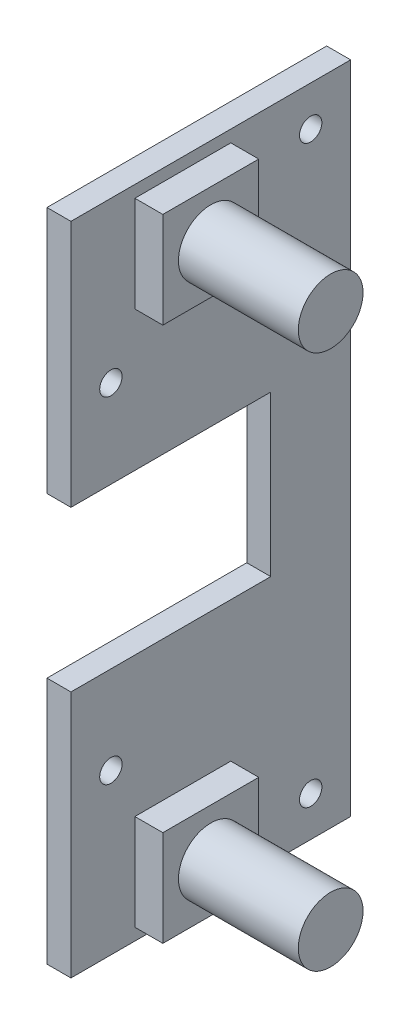
ISO-10303-21;
HEADER;
FILE_DESCRIPTION(('STEP AP214'),'2;1');
FILE_NAME('part.step','',(''),(''),'','','');
FILE_SCHEMA(('AUTOMOTIVE_DESIGN { 1 0 10303 214 1 1 1 1 }'));
ENDSEC;
DATA;
#1=APPLICATION_CONTEXT('core data for automotive mechanical design processes');
#2=APPLICATION_PROTOCOL_DEFINITION('international standard','automotive_design',2000,#1);
#3=PRODUCT_CONTEXT('',#1,'mechanical');
#4=PRODUCT('Part','Part','',(#3));
#5=PRODUCT_RELATED_PRODUCT_CATEGORY('part','',(#4));
#6=PRODUCT_DEFINITION_FORMATION('','',#4);
#7=PRODUCT_DEFINITION_CONTEXT('part definition',#1,'design');
#8=PRODUCT_DEFINITION('design','',#6,#7);
#9=PRODUCT_DEFINITION_SHAPE('','',#8);
#10=(LENGTH_UNIT() NAMED_UNIT(*) SI_UNIT(.MILLI.,.METRE.));
#11=(NAMED_UNIT(*) PLANE_ANGLE_UNIT() SI_UNIT($,.RADIAN.));
#12=(NAMED_UNIT(*) SI_UNIT($,.STERADIAN.) SOLID_ANGLE_UNIT());
#13=UNCERTAINTY_MEASURE_WITH_UNIT(LENGTH_MEASURE(1.E-05),#10,'distance_accuracy_value','');
#14=(GEOMETRIC_REPRESENTATION_CONTEXT(3) GLOBAL_UNCERTAINTY_ASSIGNED_CONTEXT((#13)) GLOBAL_UNIT_ASSIGNED_CONTEXT((#10,
#11,#12)) REPRESENTATION_CONTEXT('',''));
#15=CARTESIAN_POINT('',(0.,0.,0.));
#16=DIRECTION('',(0.,0.,1.));
#17=DIRECTION('',(1.,0.,0.));
#18=AXIS2_PLACEMENT_3D('',#15,#16,#17);
#19=CARTESIAN_POINT('',(3.,0.,0.));
#20=DIRECTION('',(1.,0.,0.));
#21=DIRECTION('',(0.,0.,-1.));
#22=AXIS2_PLACEMENT_3D('',#19,#20,#21);
#23=PLANE('',#22);
#24=CARTESIAN_POINT('',(3.,21.,30.));
#25=DIRECTION('',(-1.,0.,0.));
#26=DIRECTION('',(0.,0.,-1.));
#27=AXIS2_PLACEMENT_3D('',#24,#25,#26);
#28=CIRCLE('',#27,1.4);
#29=CARTESIAN_POINT('',(3.,21.,28.6));
#30=VERTEX_POINT('',#29);
#31=EDGE_CURVE('E627',#30,#30,#28,.T.);
#32=ORIENTED_EDGE('',*,*,#31,.T.);
#33=EDGE_LOOP('',(#32));
#34=FACE_BOUND('',#33,.T.);
#35=CARTESIAN_POINT('',(3.,36.,5.));
#36=DIRECTION('',(-1.,0.,0.));
#37=DIRECTION('',(0.,0.,-1.));
#38=AXIS2_PLACEMENT_3D('',#35,#36,#37);
#39=CIRCLE('',#38,1.4);
#40=CARTESIAN_POINT('',(3.,36.,3.6));
#41=VERTEX_POINT('',#40);
#42=EDGE_CURVE('E632',#41,#41,#39,.T.);
#43=ORIENTED_EDGE('',*,*,#42,.T.);
#44=EDGE_LOOP('',(#43));
#45=FACE_BOUND('',#44,.T.);
#46=CARTESIAN_POINT('',(3.,-21.,30.));
#47=DIRECTION('',(1.,0.,0.));
#48=DIRECTION('',(0.,0.,-1.));
#49=AXIS2_PLACEMENT_3D('',#46,#47,#48);
#50=CIRCLE('',#49,1.4);
#51=CARTESIAN_POINT('',(3.,-21.,28.6));
#52=VERTEX_POINT('',#51);
#53=EDGE_CURVE('E645',#52,#52,#50,.T.);
#54=ORIENTED_EDGE('',*,*,#53,.F.);
#55=EDGE_LOOP('',(#54));
#56=FACE_BOUND('',#55,.T.);
#57=CARTESIAN_POINT('',(3.,-36.,5.));
#58=DIRECTION('',(1.,0.,0.));
#59=DIRECTION('',(0.,0.,-1.));
#60=AXIS2_PLACEMENT_3D('',#57,#58,#59);
#61=CIRCLE('',#60,1.4);
#62=CARTESIAN_POINT('',(3.,-36.,3.6));
#63=VERTEX_POINT('',#62);
#64=EDGE_CURVE('E636',#63,#63,#61,.T.);
#65=ORIENTED_EDGE('',*,*,#64,.F.);
#66=EDGE_LOOP('',(#65));
#67=FACE_BOUND('',#66,.T.);
#68=DIRECTION('',(0.,1.,0.));
#69=VECTOR('',#68,1.);
#70=CARTESIAN_POINT('',(3.,39.5,27.));
#71=LINE('',#70,#69);
#72=CARTESIAN_POINT('',(3.,27.5,27.));
#73=VERTEX_POINT('',#72);
#74=CARTESIAN_POINT('',(3.,39.5,27.));
#75=VERTEX_POINT('',#74);
#76=EDGE_CURVE('E159',#73,#75,#71,.T.);
#77=ORIENTED_EDGE('',*,*,#76,.T.);
#78=DIRECTION('',(0.,0.,-1.));
#79=VECTOR('',#78,1.);
#80=CARTESIAN_POINT('',(3.,39.5,27.));
#81=LINE('',#80,#79);
#82=CARTESIAN_POINT('',(3.,39.5,15.));
#83=VERTEX_POINT('',#82);
#84=EDGE_CURVE('E175',#75,#83,#81,.T.);
#85=ORIENTED_EDGE('',*,*,#84,.T.);
#86=DIRECTION('',(0.,-1.,0.));
#87=VECTOR('',#86,1.);
#88=CARTESIAN_POINT('',(3.,39.5,15.));
#89=LINE('',#88,#87);
#90=CARTESIAN_POINT('',(3.,27.5,15.));
#91=VERTEX_POINT('',#90);
#92=EDGE_CURVE('E61',#83,#91,#89,.T.);
#93=ORIENTED_EDGE('',*,*,#92,.T.);
#94=DIRECTION('',(0.,0.,1.));
#95=VECTOR('',#94,1.);
#96=CARTESIAN_POINT('',(3.,27.5,27.));
#97=LINE('',#96,#95);
#98=EDGE_CURVE('E56',#91,#73,#97,.T.);
#99=ORIENTED_EDGE('',*,*,#98,.T.);
#100=EDGE_LOOP('',(#77,#85,#93,#99));
#101=FACE_BOUND('',#100,.T.);
#102=DIRECTION('',(0.,0.,1.));
#103=VECTOR('',#102,1.);
#104=CARTESIAN_POINT('',(3.,-10.,9.99999999999999));
#105=LINE('',#104,#103);
#106=CARTESIAN_POINT('',(3.,-10.,9.99999999999999));
#107=VERTEX_POINT('',#106);
#108=CARTESIAN_POINT('',(3.,-10.,35.));
#109=VERTEX_POINT('',#108);
#110=EDGE_CURVE('E250',#107,#109,#105,.T.);
#111=ORIENTED_EDGE('',*,*,#110,.T.);
#112=DIRECTION('',(0.,-1.,0.));
#113=VECTOR('',#112,1.);
#114=CARTESIAN_POINT('',(3.,-10.,35.));
#115=LINE('',#114,#113);
#116=CARTESIAN_POINT('',(3.,-41.,35.));
#117=VERTEX_POINT('',#116);
#118=EDGE_CURVE('E254',#109,#117,#115,.T.);
#119=ORIENTED_EDGE('',*,*,#118,.T.);
#120=DIRECTION('',(0.,0.,-1.));
#121=VECTOR('',#120,1.);
#122=CARTESIAN_POINT('',(3.,-41.,35.));
#123=LINE('',#122,#121);
#124=CARTESIAN_POINT('',(3.,-41.,0.));
#125=VERTEX_POINT('',#124);
#126=EDGE_CURVE('E258',#117,#125,#123,.T.);
#127=ORIENTED_EDGE('',*,*,#126,.T.);
#128=DIRECTION('',(0.,1.,0.));
#129=VECTOR('',#128,1.);
#130=CARTESIAN_POINT('',(3.,-41.,0.));
#131=LINE('',#130,#129);
#132=CARTESIAN_POINT('',(3.,41.,0.));
#133=VERTEX_POINT('',#132);
#134=EDGE_CURVE('E261',#125,#133,#131,.T.);
#135=ORIENTED_EDGE('',*,*,#134,.T.);
#136=DIRECTION('',(0.,0.,1.));
#137=VECTOR('',#136,1.);
#138=CARTESIAN_POINT('',(3.,41.,0.));
#139=LINE('',#138,#137);
#140=CARTESIAN_POINT('',(3.,41.,35.));
#141=VERTEX_POINT('',#140);
#142=EDGE_CURVE('E264',#133,#141,#139,.T.);
#143=ORIENTED_EDGE('',*,*,#142,.T.);
#144=DIRECTION('',(0.,-1.,0.));
#145=VECTOR('',#144,1.);
#146=CARTESIAN_POINT('',(3.,41.,35.));
#147=LINE('',#146,#145);
#148=CARTESIAN_POINT('',(3.,9.99999999999999,35.));
#149=VERTEX_POINT('',#148);
#150=EDGE_CURVE('E267',#141,#149,#147,.T.);
#151=ORIENTED_EDGE('',*,*,#150,.T.);
#152=DIRECTION('',(0.,0.,-1.));
#153=VECTOR('',#152,1.);
#154=CARTESIAN_POINT('',(3.,9.99999999999999,35.));
#155=LINE('',#154,#153);
#156=CARTESIAN_POINT('',(3.,9.99999999999999,9.99999999999999));
#157=VERTEX_POINT('',#156);
#158=EDGE_CURVE('E270',#149,#157,#155,.T.);
#159=ORIENTED_EDGE('',*,*,#158,.T.);
#160=DIRECTION('',(0.,-1.,0.));
#161=VECTOR('',#160,1.);
#162=CARTESIAN_POINT('',(3.,9.99999999999999,9.99999999999999));
#163=LINE('',#162,#161);
#164=EDGE_CURVE('E273',#157,#107,#163,.T.);
#165=ORIENTED_EDGE('',*,*,#164,.T.);
#166=EDGE_LOOP('',(#111,#119,#127,#135,#143,#151,#159,#165));
#167=FACE_BOUND('',#166,.T.);
#168=DIRECTION('',(0.,0.,-1.));
#169=VECTOR('',#168,1.);
#170=CARTESIAN_POINT('',(3.,-39.5,27.));
#171=LINE('',#170,#169);
#172=CARTESIAN_POINT('',(3.,-39.5,27.));
#173=VERTEX_POINT('',#172);
#174=CARTESIAN_POINT('',(3.,-39.5,15.));
#175=VERTEX_POINT('',#174);
#176=EDGE_CURVE('E227',#173,#175,#171,.T.);
#177=ORIENTED_EDGE('',*,*,#176,.F.);
#178=DIRECTION('',(0.,-1.,0.));
#179=VECTOR('',#178,1.);
#180=CARTESIAN_POINT('',(3.,-39.5,27.));
#181=LINE('',#180,#179);
#182=CARTESIAN_POINT('',(3.,-27.5,27.));
#183=VERTEX_POINT('',#182);
#184=EDGE_CURVE('E207',#183,#173,#181,.T.);
#185=ORIENTED_EDGE('',*,*,#184,.F.);
#186=DIRECTION('',(0.,0.,1.));
#187=VECTOR('',#186,1.);
#188=CARTESIAN_POINT('',(3.,-27.5,27.));
#189=LINE('',#188,#187);
#190=CARTESIAN_POINT('',(3.,-27.5,15.));
#191=VERTEX_POINT('',#190);
#192=EDGE_CURVE('E214',#191,#183,#189,.T.);
#193=ORIENTED_EDGE('',*,*,#192,.F.);
#194=DIRECTION('',(0.,1.,0.));
#195=VECTOR('',#194,1.);
#196=CARTESIAN_POINT('',(3.,-39.5,15.));
#197=LINE('',#196,#195);
#198=EDGE_CURVE('E230',#175,#191,#197,.T.);
#199=ORIENTED_EDGE('',*,*,#198,.F.);
#200=EDGE_LOOP('',(#177,#185,#193,#199));
#201=FACE_BOUND('',#200,.T.);
#202=ADVANCED_FACE('F39',(#34,#45,#56,#67,#101,#167,#201),#23,.T.);
#203=CARTESIAN_POINT('',(3.,-10.,9.99999999999999));
#204=DIRECTION('',(0.,-1.,0.));
#205=DIRECTION('',(0.,0.,-1.));
#206=AXIS2_PLACEMENT_3D('',#203,#204,#205);
#207=PLANE('',#206);
#208=DIRECTION('',(0.,0.,1.));
#209=VECTOR('',#208,1.);
#210=CARTESIAN_POINT('',(0.,-10.,9.99999999999999));
#211=LINE('',#210,#209);
#212=CARTESIAN_POINT('',(0.,-10.,9.99999999999999));
#213=VERTEX_POINT('',#212);
#214=CARTESIAN_POINT('',(0.,-10.,35.));
#215=VERTEX_POINT('',#214);
#216=EDGE_CURVE('E249',#213,#215,#211,.T.);
#217=ORIENTED_EDGE('',*,*,#216,.T.);
#218=DIRECTION('',(-1.,0.,0.));
#219=VECTOR('',#218,1.);
#220=CARTESIAN_POINT('',(3.,-10.,35.));
#221=LINE('',#220,#219);
#222=EDGE_CURVE('E43',#109,#215,#221,.T.);
#223=ORIENTED_EDGE('',*,*,#222,.F.);
#224=ORIENTED_EDGE('',*,*,#110,.F.);
#225=DIRECTION('',(-1.,0.,0.));
#226=VECTOR('',#225,1.);
#227=CARTESIAN_POINT('',(3.,-10.,9.99999999999999));
#228=LINE('',#227,#226);
#229=EDGE_CURVE('E276',#107,#213,#228,.T.);
#230=ORIENTED_EDGE('',*,*,#229,.T.);
#231=EDGE_LOOP('',(#217,#223,#224,#230));
#232=FACE_BOUND('',#231,.T.);
#233=ADVANCED_FACE('F41',(#232),#207,.F.);
#234=CARTESIAN_POINT('',(3.,-10.,35.));
#235=DIRECTION('',(0.,0.,-1.));
#236=DIRECTION('',(0.,1.,0.));
#237=AXIS2_PLACEMENT_3D('',#234,#235,#236);
#238=PLANE('',#237);
#239=DIRECTION('',(0.,-1.,0.));
#240=VECTOR('',#239,1.);
#241=CARTESIAN_POINT('',(0.,-10.,35.));
#242=LINE('',#241,#240);
#243=CARTESIAN_POINT('',(0.,-41.,35.));
#244=VERTEX_POINT('',#243);
#245=EDGE_CURVE('E280',#215,#244,#242,.T.);
#246=ORIENTED_EDGE('',*,*,#245,.T.);
#247=DIRECTION('',(-1.,0.,0.));
#248=VECTOR('',#247,1.);
#249=CARTESIAN_POINT('',(3.,-41.,35.));
#250=LINE('',#249,#248);
#251=EDGE_CURVE('E322',#117,#244,#250,.T.);
#252=ORIENTED_EDGE('',*,*,#251,.F.);
#253=ORIENTED_EDGE('',*,*,#118,.F.);
#254=ORIENTED_EDGE('',*,*,#222,.T.);
#255=EDGE_LOOP('',(#246,#252,#253,#254));
#256=FACE_BOUND('',#255,.T.);
#257=ADVANCED_FACE('F333',(#256),#238,.F.);
#258=CARTESIAN_POINT('',(3.,-41.,35.));
#259=DIRECTION('',(0.,1.,0.));
#260=DIRECTION('',(0.,0.,1.));
#261=AXIS2_PLACEMENT_3D('',#258,#259,#260);
#262=PLANE('',#261);
#263=DIRECTION('',(0.,0.,-1.));
#264=VECTOR('',#263,1.);
#265=CARTESIAN_POINT('',(0.,-41.,35.));
#266=LINE('',#265,#264);
#267=CARTESIAN_POINT('',(0.,-41.,0.));
#268=VERTEX_POINT('',#267);
#269=EDGE_CURVE('E283',#244,#268,#266,.T.);
#270=ORIENTED_EDGE('',*,*,#269,.T.);
#271=DIRECTION('',(-1.,0.,0.));
#272=VECTOR('',#271,1.);
#273=CARTESIAN_POINT('',(3.,-41.,0.));
#274=LINE('',#273,#272);
#275=EDGE_CURVE('E319',#125,#268,#274,.T.);
#276=ORIENTED_EDGE('',*,*,#275,.F.);
#277=ORIENTED_EDGE('',*,*,#126,.F.);
#278=ORIENTED_EDGE('',*,*,#251,.T.);
#279=EDGE_LOOP('',(#270,#276,#277,#278));
#280=FACE_BOUND('',#279,.T.);
#281=ADVANCED_FACE('F345',(#280),#262,.F.);
#282=CARTESIAN_POINT('',(3.,-41.,0.));
#283=DIRECTION('',(0.,0.,1.));
#284=DIRECTION('',(1.,0.,0.));
#285=AXIS2_PLACEMENT_3D('',#282,#283,#284);
#286=PLANE('',#285);
#287=DIRECTION('',(0.,1.,0.));
#288=VECTOR('',#287,1.);
#289=CARTESIAN_POINT('',(0.,-41.,0.));
#290=LINE('',#289,#288);
#291=CARTESIAN_POINT('',(0.,41.,0.));
#292=VERTEX_POINT('',#291);
#293=EDGE_CURVE('E286',#268,#292,#290,.T.);
#294=ORIENTED_EDGE('',*,*,#293,.T.);
#295=DIRECTION('',(-1.,0.,0.));
#296=VECTOR('',#295,1.);
#297=CARTESIAN_POINT('',(3.,41.,0.));
#298=LINE('',#297,#296);
#299=EDGE_CURVE('E315',#133,#292,#298,.T.);
#300=ORIENTED_EDGE('',*,*,#299,.F.);
#301=ORIENTED_EDGE('',*,*,#134,.F.);
#302=ORIENTED_EDGE('',*,*,#275,.T.);
#303=EDGE_LOOP('',(#294,#300,#301,#302));
#304=FACE_BOUND('',#303,.T.);
#305=ADVANCED_FACE('F348',(#304),#286,.F.);
#306=CARTESIAN_POINT('',(3.,41.,0.));
#307=DIRECTION('',(0.,-1.,0.));
#308=DIRECTION('',(0.,0.,-1.));
#309=AXIS2_PLACEMENT_3D('',#306,#307,#308);
#310=PLANE('',#309);
#311=DIRECTION('',(0.,0.,1.));
#312=VECTOR('',#311,1.);
#313=CARTESIAN_POINT('',(0.,41.,0.));
#314=LINE('',#313,#312);
#315=CARTESIAN_POINT('',(0.,41.,35.));
#316=VERTEX_POINT('',#315);
#317=EDGE_CURVE('E289',#292,#316,#314,.T.);
#318=ORIENTED_EDGE('',*,*,#317,.T.);
#319=DIRECTION('',(-1.,0.,0.));
#320=VECTOR('',#319,1.);
#321=CARTESIAN_POINT('',(3.,41.,35.));
#322=LINE('',#321,#320);
#323=EDGE_CURVE('E311',#141,#316,#322,.T.);
#324=ORIENTED_EDGE('',*,*,#323,.F.);
#325=ORIENTED_EDGE('',*,*,#142,.F.);
#326=ORIENTED_EDGE('',*,*,#299,.T.);
#327=EDGE_LOOP('',(#318,#324,#325,#326));
#328=FACE_BOUND('',#327,.T.);
#329=ADVANCED_FACE('F367',(#328),#310,.F.);
#330=CARTESIAN_POINT('',(3.,41.,35.));
#331=DIRECTION('',(0.,0.,-1.));
#332=DIRECTION('',(0.,1.,0.));
#333=AXIS2_PLACEMENT_3D('',#330,#331,#332);
#334=PLANE('',#333);
#335=DIRECTION('',(0.,-1.,0.));
#336=VECTOR('',#335,1.);
#337=CARTESIAN_POINT('',(0.,41.,35.));
#338=LINE('',#337,#336);
#339=CARTESIAN_POINT('',(0.,9.99999999999999,35.));
#340=VERTEX_POINT('',#339);
#341=EDGE_CURVE('E292',#316,#340,#338,.T.);
#342=ORIENTED_EDGE('',*,*,#341,.T.);
#343=DIRECTION('',(-1.,0.,0.));
#344=VECTOR('',#343,1.);
#345=CARTESIAN_POINT('',(3.,9.99999999999999,35.));
#346=LINE('',#345,#344);
#347=EDGE_CURVE('E307',#149,#340,#346,.T.);
#348=ORIENTED_EDGE('',*,*,#347,.F.);
#349=ORIENTED_EDGE('',*,*,#150,.F.);
#350=ORIENTED_EDGE('',*,*,#323,.T.);
#351=EDGE_LOOP('',(#342,#348,#349,#350));
#352=FACE_BOUND('',#351,.T.);
#353=ADVANCED_FACE('F364',(#352),#334,.F.);
#354=CARTESIAN_POINT('',(3.,9.99999999999999,35.));
#355=DIRECTION('',(0.,1.,0.));
#356=DIRECTION('',(0.,0.,1.));
#357=AXIS2_PLACEMENT_3D('',#354,#355,#356);
#358=PLANE('',#357);
#359=DIRECTION('',(0.,0.,-1.));
#360=VECTOR('',#359,1.);
#361=CARTESIAN_POINT('',(0.,9.99999999999999,35.));
#362=LINE('',#361,#360);
#363=CARTESIAN_POINT('',(0.,9.99999999999999,9.99999999999999));
#364=VERTEX_POINT('',#363);
#365=EDGE_CURVE('E295',#340,#364,#362,.T.);
#366=ORIENTED_EDGE('',*,*,#365,.T.);
#367=DIRECTION('',(-1.,0.,0.));
#368=VECTOR('',#367,1.);
#369=CARTESIAN_POINT('',(3.,9.99999999999999,9.99999999999999));
#370=LINE('',#369,#368);
#371=EDGE_CURVE('E303',#157,#364,#370,.T.);
#372=ORIENTED_EDGE('',*,*,#371,.F.);
#373=ORIENTED_EDGE('',*,*,#158,.F.);
#374=ORIENTED_EDGE('',*,*,#347,.T.);
#375=EDGE_LOOP('',(#366,#372,#373,#374));
#376=FACE_BOUND('',#375,.T.);
#377=ADVANCED_FACE('F360',(#376),#358,.F.);
#378=CARTESIAN_POINT('',(3.,9.99999999999999,9.99999999999999));
#379=DIRECTION('',(0.,0.,-1.));
#380=DIRECTION('',(0.,1.,0.));
#381=AXIS2_PLACEMENT_3D('',#378,#379,#380);
#382=PLANE('',#381);
#383=DIRECTION('',(0.,-1.,0.));
#384=VECTOR('',#383,1.);
#385=CARTESIAN_POINT('',(0.,9.99999999999999,9.99999999999999));
#386=LINE('',#385,#384);
#387=EDGE_CURVE('E255',#364,#213,#386,.T.);
#388=ORIENTED_EDGE('',*,*,#387,.T.);
#389=ORIENTED_EDGE('',*,*,#229,.F.);
#390=ORIENTED_EDGE('',*,*,#164,.F.);
#391=ORIENTED_EDGE('',*,*,#371,.T.);
#392=EDGE_LOOP('',(#388,#389,#390,#391));
#393=FACE_BOUND('',#392,.T.);
#394=ADVANCED_FACE('F358',(#393),#382,.F.);
#395=CARTESIAN_POINT('',(0.,0.,0.));
#396=DIRECTION('',(1.,0.,0.));
#397=DIRECTION('',(0.,0.,-1.));
#398=AXIS2_PLACEMENT_3D('',#395,#396,#397);
#399=PLANE('',#398);
#400=CARTESIAN_POINT('',(0.,21.,30.));
#401=DIRECTION('',(1.,0.,0.));
#402=DIRECTION('',(0.,0.,-1.));
#403=AXIS2_PLACEMENT_3D('',#400,#401,#402);
#404=CIRCLE('',#403,1.4);
#405=CARTESIAN_POINT('',(0.,21.,28.6));
#406=VERTEX_POINT('',#405);
#407=EDGE_CURVE('E630',#406,#406,#404,.T.);
#408=ORIENTED_EDGE('',*,*,#407,.T.);
#409=EDGE_LOOP('',(#408));
#410=FACE_BOUND('',#409,.T.);
#411=CARTESIAN_POINT('',(0.,36.,5.));
#412=DIRECTION('',(1.,0.,0.));
#413=DIRECTION('',(0.,0.,-1.));
#414=AXIS2_PLACEMENT_3D('',#411,#412,#413);
#415=CIRCLE('',#414,1.4);
#416=CARTESIAN_POINT('',(0.,36.,3.6));
#417=VERTEX_POINT('',#416);
#418=EDGE_CURVE('E639',#417,#417,#415,.T.);
#419=ORIENTED_EDGE('',*,*,#418,.T.);
#420=EDGE_LOOP('',(#419));
#421=FACE_BOUND('',#420,.T.);
#422=CARTESIAN_POINT('',(0.,-21.,30.));
#423=DIRECTION('',(1.,0.,0.));
#424=DIRECTION('',(0.,0.,-1.));
#425=AXIS2_PLACEMENT_3D('',#422,#423,#424);
#426=CIRCLE('',#425,1.4);
#427=CARTESIAN_POINT('',(0.,-21.,28.6));
#428=VERTEX_POINT('',#427);
#429=EDGE_CURVE('E649',#428,#428,#426,.F.);
#430=ORIENTED_EDGE('',*,*,#429,.F.);
#431=EDGE_LOOP('',(#430));
#432=FACE_BOUND('',#431,.T.);
#433=CARTESIAN_POINT('',(0.,-36.,5.));
#434=DIRECTION('',(1.,0.,0.));
#435=DIRECTION('',(0.,0.,-1.));
#436=AXIS2_PLACEMENT_3D('',#433,#434,#435);
#437=CIRCLE('',#436,1.4);
#438=CARTESIAN_POINT('',(0.,-36.,3.6));
#439=VERTEX_POINT('',#438);
#440=EDGE_CURVE('E650',#439,#439,#437,.F.);
#441=ORIENTED_EDGE('',*,*,#440,.F.);
#442=EDGE_LOOP('',(#441));
#443=FACE_BOUND('',#442,.T.);
#444=ORIENTED_EDGE('',*,*,#216,.F.);
#445=ORIENTED_EDGE('',*,*,#387,.F.);
#446=ORIENTED_EDGE('',*,*,#365,.F.);
#447=ORIENTED_EDGE('',*,*,#341,.F.);
#448=ORIENTED_EDGE('',*,*,#317,.F.);
#449=ORIENTED_EDGE('',*,*,#293,.F.);
#450=ORIENTED_EDGE('',*,*,#269,.F.);
#451=ORIENTED_EDGE('',*,*,#245,.F.);
#452=EDGE_LOOP('',(#444,#445,#446,#447,#448,#449,#450,#451));
#453=FACE_BOUND('',#452,.T.);
#454=ADVANCED_FACE('F340',(#410,#421,#432,#443,#453),#399,.F.);
#455=CARTESIAN_POINT('',(6.5,-39.5,27.));
#456=DIRECTION('',(0.,0.,-1.));
#457=DIRECTION('',(-1.,0.,0.));
#458=AXIS2_PLACEMENT_3D('',#455,#456,#457);
#459=PLANE('',#458);
#460=ORIENTED_EDGE('',*,*,#184,.T.);
#461=DIRECTION('',(-1.,0.,0.));
#462=VECTOR('',#461,1.);
#463=CARTESIAN_POINT('',(6.5,-39.5,27.));
#464=LINE('',#463,#462);
#465=CARTESIAN_POINT('',(6.5,-39.5,27.));
#466=VERTEX_POINT('',#465);
#467=EDGE_CURVE('E246',#466,#173,#464,.T.);
#468=ORIENTED_EDGE('',*,*,#467,.F.);
#469=DIRECTION('',(0.,-1.,0.));
#470=VECTOR('',#469,1.);
#471=CARTESIAN_POINT('',(6.5,-39.5,27.));
#472=LINE('',#471,#470);
#473=CARTESIAN_POINT('',(6.5,-27.5,27.));
#474=VERTEX_POINT('',#473);
#475=EDGE_CURVE('E209',#474,#466,#472,.T.);
#476=ORIENTED_EDGE('',*,*,#475,.F.);
#477=DIRECTION('',(-1.,0.,0.));
#478=VECTOR('',#477,1.);
#479=CARTESIAN_POINT('',(6.5,-27.5,27.));
#480=LINE('',#479,#478);
#481=EDGE_CURVE('E223',#474,#183,#480,.T.);
#482=ORIENTED_EDGE('',*,*,#481,.T.);
#483=EDGE_LOOP('',(#460,#468,#476,#482));
#484=FACE_BOUND('',#483,.T.);
#485=ADVANCED_FACE('F386',(#484),#459,.F.);
#486=CARTESIAN_POINT('',(6.5,-39.5,27.));
#487=DIRECTION('',(0.,1.,0.));
#488=DIRECTION('',(0.,0.,1.));
#489=AXIS2_PLACEMENT_3D('',#486,#487,#488);
#490=PLANE('',#489);
#491=ORIENTED_EDGE('',*,*,#176,.T.);
#492=DIRECTION('',(-1.,0.,0.));
#493=VECTOR('',#492,1.);
#494=CARTESIAN_POINT('',(6.5,-39.5,15.));
#495=LINE('',#494,#493);
#496=CARTESIAN_POINT('',(6.5,-39.5,15.));
#497=VERTEX_POINT('',#496);
#498=EDGE_CURVE('E242',#497,#175,#495,.T.);
#499=ORIENTED_EDGE('',*,*,#498,.F.);
#500=DIRECTION('',(0.,0.,-1.));
#501=VECTOR('',#500,1.);
#502=CARTESIAN_POINT('',(6.5,-39.5,27.));
#503=LINE('',#502,#501);
#504=EDGE_CURVE('E213',#466,#497,#503,.T.);
#505=ORIENTED_EDGE('',*,*,#504,.F.);
#506=ORIENTED_EDGE('',*,*,#467,.T.);
#507=EDGE_LOOP('',(#491,#499,#505,#506));
#508=FACE_BOUND('',#507,.T.);
#509=ADVANCED_FACE('F413',(#508),#490,.F.);
#510=CARTESIAN_POINT('',(6.5,-39.5,15.));
#511=DIRECTION('',(0.,0.,1.));
#512=DIRECTION('',(0.,-1.,0.));
#513=AXIS2_PLACEMENT_3D('',#510,#511,#512);
#514=PLANE('',#513);
#515=ORIENTED_EDGE('',*,*,#198,.T.);
#516=DIRECTION('',(-1.,0.,0.));
#517=VECTOR('',#516,1.);
#518=CARTESIAN_POINT('',(6.5,-27.5,15.));
#519=LINE('',#518,#517);
#520=CARTESIAN_POINT('',(6.5,-27.5,15.));
#521=VERTEX_POINT('',#520);
#522=EDGE_CURVE('E239',#521,#191,#519,.T.);
#523=ORIENTED_EDGE('',*,*,#522,.F.);
#524=DIRECTION('',(0.,1.,0.));
#525=VECTOR('',#524,1.);
#526=CARTESIAN_POINT('',(6.5,-39.5,15.));
#527=LINE('',#526,#525);
#528=EDGE_CURVE('E217',#497,#521,#527,.T.);
#529=ORIENTED_EDGE('',*,*,#528,.F.);
#530=ORIENTED_EDGE('',*,*,#498,.T.);
#531=EDGE_LOOP('',(#515,#523,#529,#530));
#532=FACE_BOUND('',#531,.T.);
#533=ADVANCED_FACE('F420',(#532),#514,.F.);
#534=CARTESIAN_POINT('',(6.5,-27.5,27.));
#535=DIRECTION('',(0.,-1.,0.));
#536=DIRECTION('',(0.,0.,-1.));
#537=AXIS2_PLACEMENT_3D('',#534,#535,#536);
#538=PLANE('',#537);
#539=ORIENTED_EDGE('',*,*,#192,.T.);
#540=ORIENTED_EDGE('',*,*,#481,.F.);
#541=DIRECTION('',(0.,0.,1.));
#542=VECTOR('',#541,1.);
#543=CARTESIAN_POINT('',(6.5,-27.5,27.));
#544=LINE('',#543,#542);
#545=EDGE_CURVE('E220',#521,#474,#544,.T.);
#546=ORIENTED_EDGE('',*,*,#545,.F.);
#547=ORIENTED_EDGE('',*,*,#522,.T.);
#548=EDGE_LOOP('',(#539,#540,#546,#547));
#549=FACE_BOUND('',#548,.T.);
#550=ADVANCED_FACE('F427',(#549),#538,.F.);
#551=CARTESIAN_POINT('',(6.5,0.,0.));
#552=DIRECTION('',(-1.,0.,0.));
#553=DIRECTION('',(0.,0.,1.));
#554=AXIS2_PLACEMENT_3D('',#551,#552,#553);
#555=PLANE('',#554);
#556=CARTESIAN_POINT('',(6.5,-33.5,21.));
#557=DIRECTION('',(1.,0.,0.));
#558=DIRECTION('',(0.,0.,-1.));
#559=AXIS2_PLACEMENT_3D('',#556,#557,#558);
#560=CIRCLE('',#559,4.05);
#561=CARTESIAN_POINT('',(6.5,-33.5,16.95));
#562=VERTEX_POINT('',#561);
#563=EDGE_CURVE('E11',#562,#562,#560,.T.);
#564=ORIENTED_EDGE('',*,*,#563,.F.);
#565=EDGE_LOOP('',(#564));
#566=FACE_BOUND('',#565,.T.);
#567=ORIENTED_EDGE('',*,*,#475,.T.);
#568=ORIENTED_EDGE('',*,*,#504,.T.);
#569=ORIENTED_EDGE('',*,*,#528,.T.);
#570=ORIENTED_EDGE('',*,*,#545,.T.);
#571=EDGE_LOOP('',(#567,#568,#569,#570));
#572=FACE_BOUND('',#571,.T.);
#573=ADVANCED_FACE('F435',(#566,#572),#555,.F.);
#574=CARTESIAN_POINT('',(21.5,-33.5,21.));
#575=DIRECTION('',(-1.,0.,0.));
#576=DIRECTION('',(0.,0.,1.));
#577=AXIS2_PLACEMENT_3D('',#574,#575,#576);
#578=CYLINDRICAL_SURFACE('',#577,4.05);
#579=CARTESIAN_POINT('',(21.5,-33.5,21.));
#580=DIRECTION('',(1.,0.,0.));
#581=DIRECTION('',(0.,0.,-1.));
#582=AXIS2_PLACEMENT_3D('',#579,#580,#581);
#583=CIRCLE('',#582,4.05);
#584=CARTESIAN_POINT('',(21.5,-33.5,16.95));
#585=VERTEX_POINT('',#584);
#586=EDGE_CURVE('E163',#585,#585,#583,.T.);
#587=ORIENTED_EDGE('',*,*,#586,.F.);
#588=EDGE_LOOP('',(#587));
#589=FACE_BOUND('',#588,.T.);
#590=ORIENTED_EDGE('',*,*,#563,.T.);
#591=EDGE_LOOP('',(#590));
#592=FACE_BOUND('',#591,.T.);
#593=ADVANCED_FACE('F443',(#589,#592),#578,.T.);
#594=CARTESIAN_POINT('',(21.5,-33.5,21.));
#595=DIRECTION('',(1.,0.,0.));
#596=DIRECTION('',(0.,0.,-1.));
#597=AXIS2_PLACEMENT_3D('',#594,#595,#596);
#598=PLANE('',#597);
#599=ORIENTED_EDGE('',*,*,#586,.T.);
#600=EDGE_LOOP('',(#599));
#601=FACE_BOUND('',#600,.T.);
#602=ADVANCED_FACE('F451',(#601),#598,.T.);
#603=CARTESIAN_POINT('',(6.5,39.5,27.));
#604=DIRECTION('',(0.,0.,1.));
#605=DIRECTION('',(1.,0.,0.));
#606=AXIS2_PLACEMENT_3D('',#603,#604,#605);
#607=PLANE('',#606);
#608=ORIENTED_EDGE('',*,*,#76,.F.);
#609=DIRECTION('',(-1.,0.,0.));
#610=VECTOR('',#609,1.);
#611=CARTESIAN_POINT('',(6.5,27.5,27.));
#612=LINE('',#611,#610);
#613=CARTESIAN_POINT('',(6.5,27.5,27.));
#614=VERTEX_POINT('',#613);
#615=EDGE_CURVE('E153',#614,#73,#612,.T.);
#616=ORIENTED_EDGE('',*,*,#615,.F.);
#617=DIRECTION('',(0.,1.,0.));
#618=VECTOR('',#617,1.);
#619=CARTESIAN_POINT('',(6.5,39.5,27.));
#620=LINE('',#619,#618);
#621=CARTESIAN_POINT('',(6.5,39.5,27.));
#622=VERTEX_POINT('',#621);
#623=EDGE_CURVE('E157',#614,#622,#620,.T.);
#624=ORIENTED_EDGE('',*,*,#623,.T.);
#625=DIRECTION('',(-1.,0.,0.));
#626=VECTOR('',#625,1.);
#627=CARTESIAN_POINT('',(6.5,39.5,27.));
#628=LINE('',#627,#626);
#629=EDGE_CURVE('E187',#622,#75,#628,.T.);
#630=ORIENTED_EDGE('',*,*,#629,.T.);
#631=EDGE_LOOP('',(#608,#616,#624,#630));
#632=FACE_BOUND('',#631,.T.);
#633=ADVANCED_FACE('F155',(#632),#607,.T.);
#634=CARTESIAN_POINT('',(6.5,27.5,27.));
#635=DIRECTION('',(0.,-1.,0.));
#636=DIRECTION('',(0.,0.,-1.));
#637=AXIS2_PLACEMENT_3D('',#634,#635,#636);
#638=PLANE('',#637);
#639=ORIENTED_EDGE('',*,*,#98,.F.);
#640=DIRECTION('',(-1.,0.,0.));
#641=VECTOR('',#640,1.);
#642=CARTESIAN_POINT('',(6.5,27.5,15.));
#643=LINE('',#642,#641);
#644=CARTESIAN_POINT('',(6.5,27.5,15.));
#645=VERTEX_POINT('',#644);
#646=EDGE_CURVE('E164',#645,#91,#643,.T.);
#647=ORIENTED_EDGE('',*,*,#646,.F.);
#648=DIRECTION('',(0.,0.,1.));
#649=VECTOR('',#648,1.);
#650=CARTESIAN_POINT('',(6.5,27.5,27.));
#651=LINE('',#650,#649);
#652=EDGE_CURVE('E170',#645,#614,#651,.T.);
#653=ORIENTED_EDGE('',*,*,#652,.T.);
#654=ORIENTED_EDGE('',*,*,#615,.T.);
#655=EDGE_LOOP('',(#639,#647,#653,#654));
#656=FACE_BOUND('',#655,.T.);
#657=ADVANCED_FACE('F177',(#656),#638,.T.);
#658=CARTESIAN_POINT('',(6.5,39.5,15.));
#659=DIRECTION('',(0.,0.,-1.));
#660=DIRECTION('',(0.,1.,0.));
#661=AXIS2_PLACEMENT_3D('',#658,#659,#660);
#662=PLANE('',#661);
#663=ORIENTED_EDGE('',*,*,#92,.F.);
#664=DIRECTION('',(-1.,0.,0.));
#665=VECTOR('',#664,1.);
#666=CARTESIAN_POINT('',(6.5,39.5,15.));
#667=LINE('',#666,#665);
#668=CARTESIAN_POINT('',(6.5,39.5,15.));
#669=VERTEX_POINT('',#668);
#670=EDGE_CURVE('E199',#669,#83,#667,.T.);
#671=ORIENTED_EDGE('',*,*,#670,.F.);
#672=DIRECTION('',(0.,-1.,0.));
#673=VECTOR('',#672,1.);
#674=CARTESIAN_POINT('',(6.5,39.5,15.));
#675=LINE('',#674,#673);
#676=EDGE_CURVE('E179',#669,#645,#675,.T.);
#677=ORIENTED_EDGE('',*,*,#676,.T.);
#678=ORIENTED_EDGE('',*,*,#646,.T.);
#679=EDGE_LOOP('',(#663,#671,#677,#678));
#680=FACE_BOUND('',#679,.T.);
#681=ADVANCED_FACE('F472',(#680),#662,.T.);
#682=CARTESIAN_POINT('',(6.5,39.5,27.));
#683=DIRECTION('',(0.,1.,0.));
#684=DIRECTION('',(0.,0.,1.));
#685=AXIS2_PLACEMENT_3D('',#682,#683,#684);
#686=PLANE('',#685);
#687=ORIENTED_EDGE('',*,*,#84,.F.);
#688=ORIENTED_EDGE('',*,*,#629,.F.);
#689=DIRECTION('',(0.,0.,-1.));
#690=VECTOR('',#689,1.);
#691=CARTESIAN_POINT('',(6.5,39.5,27.));
#692=LINE('',#691,#690);
#693=EDGE_CURVE('E173',#622,#669,#692,.T.);
#694=ORIENTED_EDGE('',*,*,#693,.T.);
#695=ORIENTED_EDGE('',*,*,#670,.T.);
#696=EDGE_LOOP('',(#687,#688,#694,#695));
#697=FACE_BOUND('',#696,.T.);
#698=ADVANCED_FACE('F479',(#697),#686,.T.);
#699=CARTESIAN_POINT('',(6.5,0.,0.));
#700=DIRECTION('',(-1.,0.,0.));
#701=DIRECTION('',(0.,0.,1.));
#702=AXIS2_PLACEMENT_3D('',#699,#700,#701);
#703=PLANE('',#702);
#704=CARTESIAN_POINT('',(6.5,33.5,21.));
#705=DIRECTION('',(-1.,0.,0.));
#706=DIRECTION('',(0.,0.,-1.));
#707=AXIS2_PLACEMENT_3D('',#704,#705,#706);
#708=CIRCLE('',#707,4.05);
#709=CARTESIAN_POINT('',(6.5,33.5,16.95));
#710=VERTEX_POINT('',#709);
#711=EDGE_CURVE('E654',#710,#710,#708,.T.);
#712=ORIENTED_EDGE('',*,*,#711,.T.);
#713=EDGE_LOOP('',(#712));
#714=FACE_BOUND('',#713,.T.);
#715=ORIENTED_EDGE('',*,*,#623,.F.);
#716=ORIENTED_EDGE('',*,*,#652,.F.);
#717=ORIENTED_EDGE('',*,*,#676,.F.);
#718=ORIENTED_EDGE('',*,*,#693,.F.);
#719=EDGE_LOOP('',(#715,#716,#717,#718));
#720=FACE_BOUND('',#719,.T.);
#721=ADVANCED_FACE('F168',(#714,#720),#703,.F.);
#722=CARTESIAN_POINT('',(21.5,33.5,21.));
#723=DIRECTION('',(-1.,0.,0.));
#724=DIRECTION('',(0.,0.,1.));
#725=AXIS2_PLACEMENT_3D('',#722,#723,#724);
#726=CYLINDRICAL_SURFACE('',#725,4.05);
#727=CARTESIAN_POINT('',(21.5,33.5,21.));
#728=DIRECTION('',(-1.,0.,0.));
#729=DIRECTION('',(0.,0.,-1.));
#730=AXIS2_PLACEMENT_3D('',#727,#728,#729);
#731=CIRCLE('',#730,4.05);
#732=CARTESIAN_POINT('',(21.5,33.5,16.95));
#733=VERTEX_POINT('',#732);
#734=EDGE_CURVE('E190',#733,#733,#731,.T.);
#735=ORIENTED_EDGE('',*,*,#734,.T.);
#736=EDGE_LOOP('',(#735));
#737=FACE_BOUND('',#736,.T.);
#738=ORIENTED_EDGE('',*,*,#711,.F.);
#739=EDGE_LOOP('',(#738));
#740=FACE_BOUND('',#739,.T.);
#741=ADVANCED_FACE('F494',(#737,#740),#726,.T.);
#742=CARTESIAN_POINT('',(21.5,33.5,21.));
#743=DIRECTION('',(1.,0.,0.));
#744=DIRECTION('',(0.,0.,-1.));
#745=AXIS2_PLACEMENT_3D('',#742,#743,#744);
#746=PLANE('',#745);
#747=ORIENTED_EDGE('',*,*,#734,.F.);
#748=EDGE_LOOP('',(#747));
#749=FACE_BOUND('',#748,.T.);
#750=ADVANCED_FACE('F502',(#749),#746,.T.);
#751=CARTESIAN_POINT('',(-0.00100000000000013,-36.,5.));
#752=DIRECTION('',(1.,0.,0.));
#753=DIRECTION('',(0.,0.,-1.));
#754=AXIS2_PLACEMENT_3D('',#751,#752,#753);
#755=CYLINDRICAL_SURFACE('',#754,1.4);
#756=CARTESIAN_POINT('',(3.,-36.,3.6));
#757=CARTESIAN_POINT('',(2.96875,-36.,3.6));
#758=CARTESIAN_POINT('',(2.9375,-36.,3.6));
#759=CARTESIAN_POINT('',(2.875,-36.,3.6));
#760=CARTESIAN_POINT('',(2.84375,-36.,3.6));
#761=CARTESIAN_POINT('',(2.78125,-36.,3.6));
#762=CARTESIAN_POINT('',(2.75,-36.,3.6));
#763=CARTESIAN_POINT('',(2.6875,-36.,3.6));
#764=CARTESIAN_POINT('',(2.65625,-36.,3.6));
#765=CARTESIAN_POINT('',(2.59375,-36.,3.6));
#766=CARTESIAN_POINT('',(2.5625,-36.,3.6));
#767=CARTESIAN_POINT('',(2.5,-36.,3.6));
#768=CARTESIAN_POINT('',(2.46875,-36.,3.6));
#769=CARTESIAN_POINT('',(2.40625,-36.,3.6));
#770=CARTESIAN_POINT('',(2.375,-36.,3.6));
#771=CARTESIAN_POINT('',(2.3125,-36.,3.6));
#772=CARTESIAN_POINT('',(2.28125,-36.,3.6));
#773=CARTESIAN_POINT('',(2.21875,-36.,3.6));
#774=CARTESIAN_POINT('',(2.1875,-36.,3.6));
#775=CARTESIAN_POINT('',(2.125,-36.,3.6));
#776=CARTESIAN_POINT('',(2.09375,-36.,3.6));
#777=CARTESIAN_POINT('',(2.03125,-36.,3.6));
#778=CARTESIAN_POINT('',(2.,-36.,3.6));
#779=CARTESIAN_POINT('',(1.9375,-36.,3.6));
#780=CARTESIAN_POINT('',(1.90625,-36.,3.6));
#781=CARTESIAN_POINT('',(1.84375,-36.,3.6));
#782=CARTESIAN_POINT('',(1.8125,-36.,3.6));
#783=CARTESIAN_POINT('',(1.75,-36.,3.6));
#784=CARTESIAN_POINT('',(1.71875,-36.,3.6));
#785=CARTESIAN_POINT('',(1.65625,-36.,3.6));
#786=CARTESIAN_POINT('',(1.625,-36.,3.6));
#787=CARTESIAN_POINT('',(1.5625,-36.,3.6));
#788=CARTESIAN_POINT('',(1.53125,-36.,3.6));
#789=CARTESIAN_POINT('',(1.46875,-36.,3.6));
#790=CARTESIAN_POINT('',(1.4375,-36.,3.6));
#791=CARTESIAN_POINT('',(1.375,-36.,3.6));
#792=CARTESIAN_POINT('',(1.34375,-36.,3.6));
#793=CARTESIAN_POINT('',(1.28125,-36.,3.6));
#794=CARTESIAN_POINT('',(1.25,-36.,3.6));
#795=CARTESIAN_POINT('',(1.1875,-36.,3.6));
#796=CARTESIAN_POINT('',(1.15625,-36.,3.6));
#797=CARTESIAN_POINT('',(1.09375,-36.,3.6));
#798=CARTESIAN_POINT('',(1.0625,-36.,3.6));
#799=CARTESIAN_POINT('',(1.,-36.,3.6));
#800=CARTESIAN_POINT('',(0.96875,-36.,3.6));
#801=CARTESIAN_POINT('',(0.90625,-36.,3.6));
#802=CARTESIAN_POINT('',(0.875,-36.,3.6));
#803=CARTESIAN_POINT('',(0.8125,-36.,3.6));
#804=CARTESIAN_POINT('',(0.78125,-36.,3.6));
#805=CARTESIAN_POINT('',(0.71875,-36.,3.6));
#806=CARTESIAN_POINT('',(0.6875,-36.,3.6));
#807=CARTESIAN_POINT('',(0.625,-36.,3.6));
#808=CARTESIAN_POINT('',(0.59375,-36.,3.6));
#809=CARTESIAN_POINT('',(0.53125,-36.,3.6));
#810=CARTESIAN_POINT('',(0.5,-36.,3.6));
#811=CARTESIAN_POINT('',(0.4375,-36.,3.6));
#812=CARTESIAN_POINT('',(0.40625,-36.,3.6));
#813=CARTESIAN_POINT('',(0.34375,-36.,3.6));
#814=CARTESIAN_POINT('',(0.3125,-36.,3.6));
#815=CARTESIAN_POINT('',(0.25,-36.,3.6));
#816=CARTESIAN_POINT('',(0.21875,-36.,3.6));
#817=CARTESIAN_POINT('',(0.15625,-36.,3.6));
#818=CARTESIAN_POINT('',(0.125,-36.,3.6));
#819=CARTESIAN_POINT('',(0.0625000000000001,-36.,3.6));
#820=CARTESIAN_POINT('',(0.0312500000000001,-36.,3.6));
#821=CARTESIAN_POINT('',(0.,-36.,3.6));
#822=B_SPLINE_CURVE_WITH_KNOTS('',3,(#756,#757,#758,#759,#760,#761,#762,#763,#764,#765,#766,
#767,#768,#769,#770,#771,#772,#773,#774,#775,#776,#777,#778,#779,#780,#781,#782,#783,#784,#785,
#786,#787,#788,#789,#790,#791,#792,#793,#794,#795,#796,#797,#798,#799,#800,#801,#802,#803,#804,
#805,#806,#807,#808,#809,#810,#811,#812,#813,#814,#815,#816,#817,#818,#819,#820,#821),
.UNSPECIFIED.,.F.,.F.,(4,2,2,2,2,2,2,2,2,2,2,2,2,2,2,2,2,2,2,2,2,2,2,2,2,2,2,2,2,2,2,2,4),(0.,
0.0937500000000001,0.1875,0.28125,0.375,0.46875,0.5625,0.65625,0.75,0.84375,0.9375,1.03125,
1.125,1.21875,1.3125,1.40625,1.5,1.59375,1.6875,1.78125,1.875,1.96875,2.0625,2.15625,2.25,
2.34375,2.4375,2.53125,2.625,2.71875,2.8125,2.90625,3.),.UNSPECIFIED.);
#823=EDGE_CURVE('BSEAM510',#63,#439,#822,.T.);
#824=ORIENTED_EDGE('',*,*,#64,.T.);
#825=ORIENTED_EDGE('',*,*,#440,.T.);
#826=ORIENTED_EDGE('',*,*,#823,.T.);
#827=ORIENTED_EDGE('',*,*,#823,.F.);
#828=EDGE_LOOP('',(#824,#826,#825,#827));
#829=FACE_BOUND('',#828,.T.);
#830=ADVANCED_FACE('F510',(#829),#755,.F.);
#831=CARTESIAN_POINT('',(-0.00100000000000013,-21.,30.));
#832=DIRECTION('',(1.,0.,0.));
#833=DIRECTION('',(0.,0.,-1.));
#834=AXIS2_PLACEMENT_3D('',#831,#832,#833);
#835=CYLINDRICAL_SURFACE('',#834,1.4);
#836=CARTESIAN_POINT('',(3.,-21.,28.6));
#837=CARTESIAN_POINT('',(2.96875,-21.,28.6));
#838=CARTESIAN_POINT('',(2.9375,-21.,28.6));
#839=CARTESIAN_POINT('',(2.875,-21.,28.6));
#840=CARTESIAN_POINT('',(2.84375,-21.,28.6));
#841=CARTESIAN_POINT('',(2.78125,-21.,28.6));
#842=CARTESIAN_POINT('',(2.75,-21.,28.6));
#843=CARTESIAN_POINT('',(2.6875,-21.,28.6));
#844=CARTESIAN_POINT('',(2.65625,-21.,28.6));
#845=CARTESIAN_POINT('',(2.59375,-21.,28.6));
#846=CARTESIAN_POINT('',(2.5625,-21.,28.6));
#847=CARTESIAN_POINT('',(2.5,-21.,28.6));
#848=CARTESIAN_POINT('',(2.46875,-21.,28.6));
#849=CARTESIAN_POINT('',(2.40625,-21.,28.6));
#850=CARTESIAN_POINT('',(2.375,-21.,28.6));
#851=CARTESIAN_POINT('',(2.3125,-21.,28.6));
#852=CARTESIAN_POINT('',(2.28125,-21.,28.6));
#853=CARTESIAN_POINT('',(2.21875,-21.,28.6));
#854=CARTESIAN_POINT('',(2.1875,-21.,28.6));
#855=CARTESIAN_POINT('',(2.125,-21.,28.6));
#856=CARTESIAN_POINT('',(2.09375,-21.,28.6));
#857=CARTESIAN_POINT('',(2.03125,-21.,28.6));
#858=CARTESIAN_POINT('',(2.,-21.,28.6));
#859=CARTESIAN_POINT('',(1.9375,-21.,28.6));
#860=CARTESIAN_POINT('',(1.90625,-21.,28.6));
#861=CARTESIAN_POINT('',(1.84375,-21.,28.6));
#862=CARTESIAN_POINT('',(1.8125,-21.,28.6));
#863=CARTESIAN_POINT('',(1.75,-21.,28.6));
#864=CARTESIAN_POINT('',(1.71875,-21.,28.6));
#865=CARTESIAN_POINT('',(1.65625,-21.,28.6));
#866=CARTESIAN_POINT('',(1.625,-21.,28.6));
#867=CARTESIAN_POINT('',(1.5625,-21.,28.6));
#868=CARTESIAN_POINT('',(1.53125,-21.,28.6));
#869=CARTESIAN_POINT('',(1.46875,-21.,28.6));
#870=CARTESIAN_POINT('',(1.4375,-21.,28.6));
#871=CARTESIAN_POINT('',(1.375,-21.,28.6));
#872=CARTESIAN_POINT('',(1.34375,-21.,28.6));
#873=CARTESIAN_POINT('',(1.28125,-21.,28.6));
#874=CARTESIAN_POINT('',(1.25,-21.,28.6));
#875=CARTESIAN_POINT('',(1.1875,-21.,28.6));
#876=CARTESIAN_POINT('',(1.15625,-21.,28.6));
#877=CARTESIAN_POINT('',(1.09375,-21.,28.6));
#878=CARTESIAN_POINT('',(1.0625,-21.,28.6));
#879=CARTESIAN_POINT('',(1.,-21.,28.6));
#880=CARTESIAN_POINT('',(0.96875,-21.,28.6));
#881=CARTESIAN_POINT('',(0.90625,-21.,28.6));
#882=CARTESIAN_POINT('',(0.875,-21.,28.6));
#883=CARTESIAN_POINT('',(0.8125,-21.,28.6));
#884=CARTESIAN_POINT('',(0.78125,-21.,28.6));
#885=CARTESIAN_POINT('',(0.71875,-21.,28.6));
#886=CARTESIAN_POINT('',(0.6875,-21.,28.6));
#887=CARTESIAN_POINT('',(0.625,-21.,28.6));
#888=CARTESIAN_POINT('',(0.59375,-21.,28.6));
#889=CARTESIAN_POINT('',(0.53125,-21.,28.6));
#890=CARTESIAN_POINT('',(0.5,-21.,28.6));
#891=CARTESIAN_POINT('',(0.4375,-21.,28.6));
#892=CARTESIAN_POINT('',(0.40625,-21.,28.6));
#893=CARTESIAN_POINT('',(0.34375,-21.,28.6));
#894=CARTESIAN_POINT('',(0.3125,-21.,28.6));
#895=CARTESIAN_POINT('',(0.25,-21.,28.6));
#896=CARTESIAN_POINT('',(0.21875,-21.,28.6));
#897=CARTESIAN_POINT('',(0.15625,-21.,28.6));
#898=CARTESIAN_POINT('',(0.125,-21.,28.6));
#899=CARTESIAN_POINT('',(0.0625000000000001,-21.,28.6));
#900=CARTESIAN_POINT('',(0.0312500000000001,-21.,28.6));
#901=CARTESIAN_POINT('',(0.,-21.,28.6));
#902=B_SPLINE_CURVE_WITH_KNOTS('',3,(#836,#837,#838,#839,#840,#841,#842,#843,#844,#845,#846,
#847,#848,#849,#850,#851,#852,#853,#854,#855,#856,#857,#858,#859,#860,#861,#862,#863,#864,#865,
#866,#867,#868,#869,#870,#871,#872,#873,#874,#875,#876,#877,#878,#879,#880,#881,#882,#883,#884,
#885,#886,#887,#888,#889,#890,#891,#892,#893,#894,#895,#896,#897,#898,#899,#900,#901),
.UNSPECIFIED.,.F.,.F.,(4,2,2,2,2,2,2,2,2,2,2,2,2,2,2,2,2,2,2,2,2,2,2,2,2,2,2,2,2,2,2,2,4),(0.,
0.0937500000000001,0.1875,0.28125,0.375,0.46875,0.5625,0.65625,0.75,0.84375,0.9375,1.03125,
1.125,1.21875,1.3125,1.40625,1.5,1.59375,1.6875,1.78125,1.875,1.96875,2.0625,2.15625,2.25,
2.34375,2.4375,2.53125,2.625,2.71875,2.8125,2.90625,3.),.UNSPECIFIED.);
#903=EDGE_CURVE('BSEAM518',#52,#428,#902,.T.);
#904=ORIENTED_EDGE('',*,*,#53,.T.);
#905=ORIENTED_EDGE('',*,*,#429,.T.);
#906=ORIENTED_EDGE('',*,*,#903,.T.);
#907=ORIENTED_EDGE('',*,*,#903,.F.);
#908=EDGE_LOOP('',(#904,#906,#905,#907));
#909=FACE_BOUND('',#908,.T.);
#910=ADVANCED_FACE('F518',(#909),#835,.F.);
#911=CARTESIAN_POINT('',(-0.00100000000000013,36.,5.));
#912=DIRECTION('',(1.,0.,0.));
#913=DIRECTION('',(0.,0.,-1.));
#914=AXIS2_PLACEMENT_3D('',#911,#912,#913);
#915=CYLINDRICAL_SURFACE('',#914,1.4);
#916=CARTESIAN_POINT('',(3.,36.,3.6));
#917=CARTESIAN_POINT('',(2.96875,36.,3.6));
#918=CARTESIAN_POINT('',(2.9375,36.,3.6));
#919=CARTESIAN_POINT('',(2.875,36.,3.6));
#920=CARTESIAN_POINT('',(2.84375,36.,3.6));
#921=CARTESIAN_POINT('',(2.78125,36.,3.6));
#922=CARTESIAN_POINT('',(2.75,36.,3.6));
#923=CARTESIAN_POINT('',(2.6875,36.,3.6));
#924=CARTESIAN_POINT('',(2.65625,36.,3.6));
#925=CARTESIAN_POINT('',(2.59375,36.,3.6));
#926=CARTESIAN_POINT('',(2.5625,36.,3.6));
#927=CARTESIAN_POINT('',(2.5,36.,3.6));
#928=CARTESIAN_POINT('',(2.46875,36.,3.6));
#929=CARTESIAN_POINT('',(2.40625,36.,3.6));
#930=CARTESIAN_POINT('',(2.375,36.,3.6));
#931=CARTESIAN_POINT('',(2.3125,36.,3.6));
#932=CARTESIAN_POINT('',(2.28125,36.,3.6));
#933=CARTESIAN_POINT('',(2.21875,36.,3.6));
#934=CARTESIAN_POINT('',(2.1875,36.,3.6));
#935=CARTESIAN_POINT('',(2.125,36.,3.6));
#936=CARTESIAN_POINT('',(2.09375,36.,3.6));
#937=CARTESIAN_POINT('',(2.03125,36.,3.6));
#938=CARTESIAN_POINT('',(2.,36.,3.6));
#939=CARTESIAN_POINT('',(1.9375,36.,3.6));
#940=CARTESIAN_POINT('',(1.90625,36.,3.6));
#941=CARTESIAN_POINT('',(1.84375,36.,3.6));
#942=CARTESIAN_POINT('',(1.8125,36.,3.6));
#943=CARTESIAN_POINT('',(1.75,36.,3.6));
#944=CARTESIAN_POINT('',(1.71875,36.,3.6));
#945=CARTESIAN_POINT('',(1.65625,36.,3.6));
#946=CARTESIAN_POINT('',(1.625,36.,3.6));
#947=CARTESIAN_POINT('',(1.5625,36.,3.6));
#948=CARTESIAN_POINT('',(1.53125,36.,3.6));
#949=CARTESIAN_POINT('',(1.46875,36.,3.6));
#950=CARTESIAN_POINT('',(1.4375,36.,3.6));
#951=CARTESIAN_POINT('',(1.375,36.,3.6));
#952=CARTESIAN_POINT('',(1.34375,36.,3.6));
#953=CARTESIAN_POINT('',(1.28125,36.,3.6));
#954=CARTESIAN_POINT('',(1.25,36.,3.6));
#955=CARTESIAN_POINT('',(1.1875,36.,3.6));
#956=CARTESIAN_POINT('',(1.15625,36.,3.6));
#957=CARTESIAN_POINT('',(1.09375,36.,3.6));
#958=CARTESIAN_POINT('',(1.0625,36.,3.6));
#959=CARTESIAN_POINT('',(1.,36.,3.6));
#960=CARTESIAN_POINT('',(0.96875,36.,3.6));
#961=CARTESIAN_POINT('',(0.90625,36.,3.6));
#962=CARTESIAN_POINT('',(0.875,36.,3.6));
#963=CARTESIAN_POINT('',(0.8125,36.,3.6));
#964=CARTESIAN_POINT('',(0.78125,36.,3.6));
#965=CARTESIAN_POINT('',(0.71875,36.,3.6));
#966=CARTESIAN_POINT('',(0.6875,36.,3.6));
#967=CARTESIAN_POINT('',(0.625,36.,3.6));
#968=CARTESIAN_POINT('',(0.59375,36.,3.6));
#969=CARTESIAN_POINT('',(0.53125,36.,3.6));
#970=CARTESIAN_POINT('',(0.5,36.,3.6));
#971=CARTESIAN_POINT('',(0.4375,36.,3.6));
#972=CARTESIAN_POINT('',(0.40625,36.,3.6));
#973=CARTESIAN_POINT('',(0.34375,36.,3.6));
#974=CARTESIAN_POINT('',(0.3125,36.,3.6));
#975=CARTESIAN_POINT('',(0.25,36.,3.6));
#976=CARTESIAN_POINT('',(0.21875,36.,3.6));
#977=CARTESIAN_POINT('',(0.15625,36.,3.6));
#978=CARTESIAN_POINT('',(0.125,36.,3.6));
#979=CARTESIAN_POINT('',(0.0625000000000001,36.,3.6));
#980=CARTESIAN_POINT('',(0.03125,36.,3.6));
#981=CARTESIAN_POINT('',(0.,36.,3.6));
#982=B_SPLINE_CURVE_WITH_KNOTS('',3,(#916,#917,#918,#919,#920,#921,#922,#923,#924,#925,#926,
#927,#928,#929,#930,#931,#932,#933,#934,#935,#936,#937,#938,#939,#940,#941,#942,#943,#944,#945,
#946,#947,#948,#949,#950,#951,#952,#953,#954,#955,#956,#957,#958,#959,#960,#961,#962,#963,#964,
#965,#966,#967,#968,#969,#970,#971,#972,#973,#974,#975,#976,#977,#978,#979,#980,#981),
.UNSPECIFIED.,.F.,.F.,(4,2,2,2,2,2,2,2,2,2,2,2,2,2,2,2,2,2,2,2,2,2,2,2,2,2,2,2,2,2,2,2,4),(0.,
0.0937500000000001,0.1875,0.28125,0.375,0.46875,0.5625,0.65625,0.75,0.84375,0.9375,1.03125,
1.125,1.21875,1.3125,1.40625,1.5,1.59375,1.6875,1.78125,1.875,1.96875,2.0625,2.15625,2.25,
2.34375,2.4375,2.53125,2.625,2.71875,2.8125,2.90625,3.),.UNSPECIFIED.);
#983=EDGE_CURVE('BSEAM526',#41,#417,#982,.T.);
#984=ORIENTED_EDGE('',*,*,#42,.F.);
#985=ORIENTED_EDGE('',*,*,#418,.F.);
#986=ORIENTED_EDGE('',*,*,#983,.T.);
#987=ORIENTED_EDGE('',*,*,#983,.F.);
#988=EDGE_LOOP('',(#984,#986,#985,#987));
#989=FACE_BOUND('',#988,.T.);
#990=ADVANCED_FACE('F526',(#989),#915,.F.);
#991=CARTESIAN_POINT('',(-0.00100000000000013,21.,30.));
#992=DIRECTION('',(1.,0.,0.));
#993=DIRECTION('',(0.,0.,-1.));
#994=AXIS2_PLACEMENT_3D('',#991,#992,#993);
#995=CYLINDRICAL_SURFACE('',#994,1.4);
#996=CARTESIAN_POINT('',(3.,21.,28.6));
#997=CARTESIAN_POINT('',(2.96875,21.,28.6));
#998=CARTESIAN_POINT('',(2.9375,21.,28.6));
#999=CARTESIAN_POINT('',(2.875,21.,28.6));
#1000=CARTESIAN_POINT('',(2.84375,21.,28.6));
#1001=CARTESIAN_POINT('',(2.78125,21.,28.6));
#1002=CARTESIAN_POINT('',(2.75,21.,28.6));
#1003=CARTESIAN_POINT('',(2.6875,21.,28.6));
#1004=CARTESIAN_POINT('',(2.65625,21.,28.6));
#1005=CARTESIAN_POINT('',(2.59375,21.,28.6));
#1006=CARTESIAN_POINT('',(2.5625,21.,28.6));
#1007=CARTESIAN_POINT('',(2.5,21.,28.6));
#1008=CARTESIAN_POINT('',(2.46875,21.,28.6));
#1009=CARTESIAN_POINT('',(2.40625,21.,28.6));
#1010=CARTESIAN_POINT('',(2.375,21.,28.6));
#1011=CARTESIAN_POINT('',(2.3125,21.,28.6));
#1012=CARTESIAN_POINT('',(2.28125,21.,28.6));
#1013=CARTESIAN_POINT('',(2.21875,21.,28.6));
#1014=CARTESIAN_POINT('',(2.1875,21.,28.6));
#1015=CARTESIAN_POINT('',(2.125,21.,28.6));
#1016=CARTESIAN_POINT('',(2.09375,21.,28.6));
#1017=CARTESIAN_POINT('',(2.03125,21.,28.6));
#1018=CARTESIAN_POINT('',(2.,21.,28.6));
#1019=CARTESIAN_POINT('',(1.9375,21.,28.6));
#1020=CARTESIAN_POINT('',(1.90625,21.,28.6));
#1021=CARTESIAN_POINT('',(1.84375,21.,28.6));
#1022=CARTESIAN_POINT('',(1.8125,21.,28.6));
#1023=CARTESIAN_POINT('',(1.75,21.,28.6));
#1024=CARTESIAN_POINT('',(1.71875,21.,28.6));
#1025=CARTESIAN_POINT('',(1.65625,21.,28.6));
#1026=CARTESIAN_POINT('',(1.625,21.,28.6));
#1027=CARTESIAN_POINT('',(1.5625,21.,28.6));
#1028=CARTESIAN_POINT('',(1.53125,21.,28.6));
#1029=CARTESIAN_POINT('',(1.46875,21.,28.6));
#1030=CARTESIAN_POINT('',(1.4375,21.,28.6));
#1031=CARTESIAN_POINT('',(1.375,21.,28.6));
#1032=CARTESIAN_POINT('',(1.34375,21.,28.6));
#1033=CARTESIAN_POINT('',(1.28125,21.,28.6));
#1034=CARTESIAN_POINT('',(1.25,21.,28.6));
#1035=CARTESIAN_POINT('',(1.1875,21.,28.6));
#1036=CARTESIAN_POINT('',(1.15625,21.,28.6));
#1037=CARTESIAN_POINT('',(1.09375,21.,28.6));
#1038=CARTESIAN_POINT('',(1.0625,21.,28.6));
#1039=CARTESIAN_POINT('',(1.,21.,28.6));
#1040=CARTESIAN_POINT('',(0.96875,21.,28.6));
#1041=CARTESIAN_POINT('',(0.90625,21.,28.6));
#1042=CARTESIAN_POINT('',(0.875,21.,28.6));
#1043=CARTESIAN_POINT('',(0.8125,21.,28.6));
#1044=CARTESIAN_POINT('',(0.78125,21.,28.6));
#1045=CARTESIAN_POINT('',(0.71875,21.,28.6));
#1046=CARTESIAN_POINT('',(0.6875,21.,28.6));
#1047=CARTESIAN_POINT('',(0.625,21.,28.6));
#1048=CARTESIAN_POINT('',(0.59375,21.,28.6));
#1049=CARTESIAN_POINT('',(0.53125,21.,28.6));
#1050=CARTESIAN_POINT('',(0.5,21.,28.6));
#1051=CARTESIAN_POINT('',(0.4375,21.,28.6));
#1052=CARTESIAN_POINT('',(0.40625,21.,28.6));
#1053=CARTESIAN_POINT('',(0.34375,21.,28.6));
#1054=CARTESIAN_POINT('',(0.3125,21.,28.6));
#1055=CARTESIAN_POINT('',(0.25,21.,28.6));
#1056=CARTESIAN_POINT('',(0.21875,21.,28.6));
#1057=CARTESIAN_POINT('',(0.15625,21.,28.6));
#1058=CARTESIAN_POINT('',(0.125,21.,28.6));
#1059=CARTESIAN_POINT('',(0.0625000000000001,21.,28.6));
#1060=CARTESIAN_POINT('',(0.03125,21.,28.6));
#1061=CARTESIAN_POINT('',(0.,21.,28.6));
#1062=B_SPLINE_CURVE_WITH_KNOTS('',3,(#996,#997,#998,#999,#1000,#1001,#1002,#1003,#1004,#1005,
#1006,#1007,#1008,#1009,#1010,#1011,#1012,#1013,#1014,#1015,#1016,#1017,#1018,#1019,#1020,#1021,
#1022,#1023,#1024,#1025,#1026,#1027,#1028,#1029,#1030,#1031,#1032,#1033,#1034,#1035,#1036,#1037,
#1038,#1039,#1040,#1041,#1042,#1043,#1044,#1045,#1046,#1047,#1048,#1049,#1050,#1051,#1052,#1053,
#1054,#1055,#1056,#1057,#1058,#1059,#1060,#1061),.UNSPECIFIED.,.F.,.F.,(4,2,2,2,2,2,2,2,2,2,2,2,
2,2,2,2,2,2,2,2,2,2,2,2,2,2,2,2,2,2,2,2,4),(0.,0.0937500000000001,0.1875,0.28125,0.375,0.46875,
0.5625,0.65625,0.75,0.84375,0.9375,1.03125,1.125,1.21875,1.3125,1.40625,1.5,1.59375,1.6875,
1.78125,1.875,1.96875,2.0625,2.15625,2.25,2.34375,2.4375,2.53125,2.625,2.71875,2.8125,2.90625,
3.),.UNSPECIFIED.);
#1063=EDGE_CURVE('BSEAM533',#30,#406,#1062,.T.);
#1064=ORIENTED_EDGE('',*,*,#31,.F.);
#1065=ORIENTED_EDGE('',*,*,#407,.F.);
#1066=ORIENTED_EDGE('',*,*,#1063,.T.);
#1067=ORIENTED_EDGE('',*,*,#1063,.F.);
#1068=EDGE_LOOP('',(#1064,#1066,#1065,#1067));
#1069=FACE_BOUND('',#1068,.T.);
#1070=ADVANCED_FACE('F533',(#1069),#995,.F.);
#1071=CLOSED_SHELL('',(#202,#233,#257,#281,#305,#329,#353,#377,#394,#454,#485,#509,#533,#550,
#573,#593,#602,#633,#657,#681,#698,#721,#741,#750,#830,#910,#990,#1070));
#1072=MANIFOLD_SOLID_BREP('B2',#1071);
#1073=ADVANCED_BREP_SHAPE_REPRESENTATION('',(#18,#1072),#14);
#1074=SHAPE_DEFINITION_REPRESENTATION(#9,#1073);
ENDSEC;
END-ISO-10303-21;
